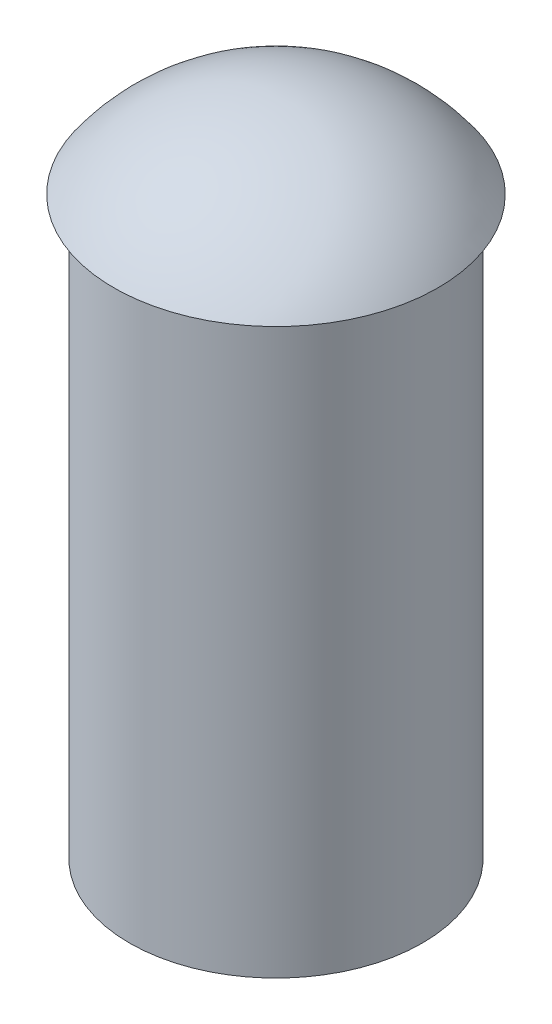
ISO-10303-21;
HEADER;
FILE_DESCRIPTION(('STEP AP214'),'2;1');
FILE_NAME('part.step','',(''),(''),'','','');
FILE_SCHEMA(('AUTOMOTIVE_DESIGN { 1 0 10303 214 1 1 1 1 }'));
ENDSEC;
DATA;
#1=APPLICATION_CONTEXT('core data for automotive mechanical design processes');
#2=APPLICATION_PROTOCOL_DEFINITION('international standard','automotive_design',2000,#1);
#3=PRODUCT_CONTEXT('',#1,'mechanical');
#4=PRODUCT('Part','Part','',(#3));
#5=PRODUCT_RELATED_PRODUCT_CATEGORY('part','',(#4));
#6=PRODUCT_DEFINITION_FORMATION('','',#4);
#7=PRODUCT_DEFINITION_CONTEXT('part definition',#1,'design');
#8=PRODUCT_DEFINITION('design','',#6,#7);
#9=PRODUCT_DEFINITION_SHAPE('','',#8);
#10=(LENGTH_UNIT() NAMED_UNIT(*) SI_UNIT(.MILLI.,.METRE.));
#11=(NAMED_UNIT(*) PLANE_ANGLE_UNIT() SI_UNIT($,.RADIAN.));
#12=(NAMED_UNIT(*) SI_UNIT($,.STERADIAN.) SOLID_ANGLE_UNIT());
#13=UNCERTAINTY_MEASURE_WITH_UNIT(LENGTH_MEASURE(1.E-05),#10,'distance_accuracy_value','');
#14=(GEOMETRIC_REPRESENTATION_CONTEXT(3) GLOBAL_UNCERTAINTY_ASSIGNED_CONTEXT((#13)) GLOBAL_UNIT_ASSIGNED_CONTEXT((#10,
#11,#12)) REPRESENTATION_CONTEXT('',''));
#15=CARTESIAN_POINT('',(0.,0.,0.));
#16=DIRECTION('',(0.,0.,1.));
#17=DIRECTION('',(1.,0.,0.));
#18=AXIS2_PLACEMENT_3D('',#15,#16,#17);
#19=CARTESIAN_POINT('',(0.,-5.5,0.));
#20=DIRECTION('',(0.,1.,0.));
#21=DIRECTION('',(0.,0.,1.));
#22=AXIS2_PLACEMENT_3D('',#19,#20,#21);
#23=CYLINDRICAL_SURFACE('',#22,1.4);
#24=CARTESIAN_POINT('',(0.,-5.5,0.));
#25=DIRECTION('',(0.,1.,0.));
#26=DIRECTION('',(0.,0.,1.));
#27=AXIS2_PLACEMENT_3D('',#24,#25,#26);
#28=CIRCLE('',#27,1.4);
#29=CARTESIAN_POINT('',(0.,-5.5,1.4));
#30=VERTEX_POINT('',#29);
#31=EDGE_CURVE('E10',#30,#30,#28,.T.);
#32=ORIENTED_EDGE('',*,*,#31,.T.);
#33=EDGE_LOOP('',(#32));
#34=FACE_BOUND('',#33,.T.);
#35=CARTESIAN_POINT('',(0.,0.,0.));
#36=DIRECTION('',(0.,1.,0.));
#37=DIRECTION('',(0.,0.,1.));
#38=AXIS2_PLACEMENT_3D('',#35,#36,#37);
#39=CIRCLE('',#38,1.4);
#40=CARTESIAN_POINT('',(0.,0.,1.4));
#41=VERTEX_POINT('',#40);
#42=EDGE_CURVE('E36',#41,#41,#39,.T.);
#43=ORIENTED_EDGE('',*,*,#42,.F.);
#44=EDGE_LOOP('',(#43));
#45=FACE_BOUND('',#44,.T.);
#46=ADVANCED_FACE('F33',(#34,#45),#23,.T.);
#47=CARTESIAN_POINT('',(0.,-5.5,0.));
#48=DIRECTION('',(0.,1.,0.));
#49=DIRECTION('',(0.,0.,1.));
#50=AXIS2_PLACEMENT_3D('',#47,#48,#49);
#51=PLANE('',#50);
#52=ORIENTED_EDGE('',*,*,#31,.F.);
#53=EDGE_LOOP('',(#52));
#54=FACE_BOUND('',#53,.T.);
#55=ADVANCED_FACE('F54',(#54),#51,.F.);
#56=CARTESIAN_POINT('',(0.,-1.1015625,0.));
#57=DIRECTION('',(0.,-1.,0.));
#58=DIRECTION('',(0.,0.,-1.));
#59=AXIS2_PLACEMENT_3D('',#56,#57,#58);
#60=SPHERICAL_SURFACE('',#59,1.9015625);
#61=CARTESIAN_POINT('',(0.,0.,0.));
#62=DIRECTION('',(0.,-1.,0.));
#63=DIRECTION('',(0.,0.,-1.));
#64=AXIS2_PLACEMENT_3D('',#61,#62,#63);
#65=CIRCLE('',#64,1.55);
#66=CARTESIAN_POINT('',(0.,0.,-1.55));
#67=VERTEX_POINT('',#66);
#68=EDGE_CURVE('E44',#67,#67,#65,.T.);
#69=ORIENTED_EDGE('',*,*,#68,.F.);
#70=EDGE_LOOP('',(#69));
#71=FACE_BOUND('',#70,.T.);
#72=ADVANCED_FACE('F52',(#71),#60,.T.);
#73=CARTESIAN_POINT('',(0.,0.,0.));
#74=DIRECTION('',(0.,1.,0.));
#75=DIRECTION('',(0.,0.,1.));
#76=AXIS2_PLACEMENT_3D('',#73,#74,#75);
#77=PLANE('',#76);
#78=ORIENTED_EDGE('',*,*,#42,.T.);
#79=EDGE_LOOP('',(#78));
#80=FACE_BOUND('',#79,.T.);
#81=ORIENTED_EDGE('',*,*,#68,.T.);
#82=EDGE_LOOP('',(#81));
#83=FACE_BOUND('',#82,.T.);
#84=ADVANCED_FACE('F50',(#80,#83),#77,.F.);
#85=CLOSED_SHELL('',(#46,#55,#72,#84));
#86=MANIFOLD_SOLID_BREP('B2',#85);
#87=ADVANCED_BREP_SHAPE_REPRESENTATION('',(#18,#86),#14);
#88=SHAPE_DEFINITION_REPRESENTATION(#9,#87);
ENDSEC;
END-ISO-10303-21;
